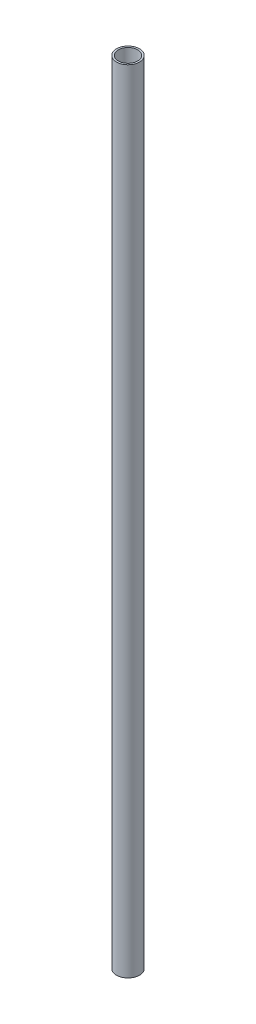
ISO-10303-21;
HEADER;
FILE_DESCRIPTION(('STEP AP214'),'2;1');
FILE_NAME('part.step','',(''),(''),'','','');
FILE_SCHEMA(('AUTOMOTIVE_DESIGN { 1 0 10303 214 1 1 1 1 }'));
ENDSEC;
DATA;
#1=APPLICATION_CONTEXT('core data for automotive mechanical design processes');
#2=APPLICATION_PROTOCOL_DEFINITION('international standard','automotive_design',2000,#1);
#3=PRODUCT_CONTEXT('',#1,'mechanical');
#4=PRODUCT('Part','Part','',(#3));
#5=PRODUCT_RELATED_PRODUCT_CATEGORY('part','',(#4));
#6=PRODUCT_DEFINITION_FORMATION('','',#4);
#7=PRODUCT_DEFINITION_CONTEXT('part definition',#1,'design');
#8=PRODUCT_DEFINITION('design','',#6,#7);
#9=PRODUCT_DEFINITION_SHAPE('','',#8);
#10=(LENGTH_UNIT() NAMED_UNIT(*) SI_UNIT(.MILLI.,.METRE.));
#11=(NAMED_UNIT(*) PLANE_ANGLE_UNIT() SI_UNIT($,.RADIAN.));
#12=(NAMED_UNIT(*) SI_UNIT($,.STERADIAN.) SOLID_ANGLE_UNIT());
#13=UNCERTAINTY_MEASURE_WITH_UNIT(LENGTH_MEASURE(1.E-05),#10,'distance_accuracy_value','');
#14=(GEOMETRIC_REPRESENTATION_CONTEXT(3) GLOBAL_UNCERTAINTY_ASSIGNED_CONTEXT((#13)) GLOBAL_UNIT_ASSIGNED_CONTEXT((#10,
#11,#12)) REPRESENTATION_CONTEXT('',''));
#15=CARTESIAN_POINT('',(0.,0.,0.));
#16=DIRECTION('',(0.,0.,1.));
#17=DIRECTION('',(1.,0.,0.));
#18=AXIS2_PLACEMENT_3D('',#15,#16,#17);
#19=CARTESIAN_POINT('',(0.,546.1,0.));
#20=DIRECTION('',(0.,1.,0.));
#21=DIRECTION('',(0.,0.,1.));
#22=AXIS2_PLACEMENT_3D('',#19,#20,#21);
#23=PLANE('',#22);
#24=CARTESIAN_POINT('',(0.,546.1,0.));
#25=DIRECTION('',(0.,1.,0.));
#26=DIRECTION('',(0.,0.,1.));
#27=AXIS2_PLACEMENT_3D('',#24,#25,#26);
#28=CIRCLE('',#27,7.9375);
#29=CARTESIAN_POINT('',(0.,546.1,7.9375));
#30=VERTEX_POINT('',#29);
#31=EDGE_CURVE('E10',#30,#30,#28,.T.);
#32=ORIENTED_EDGE('',*,*,#31,.T.);
#33=EDGE_LOOP('',(#32));
#34=FACE_BOUND('',#33,.T.);
#35=CARTESIAN_POINT('',(0.,546.1,0.));
#36=DIRECTION('',(0.,1.,0.));
#37=DIRECTION('',(0.,0.,1.));
#38=AXIS2_PLACEMENT_3D('',#35,#36,#37);
#39=CIRCLE('',#38,6.6929);
#40=CARTESIAN_POINT('',(0.,546.1,6.6929));
#41=VERTEX_POINT('',#40);
#42=EDGE_CURVE('E48',#41,#41,#39,.T.);
#43=ORIENTED_EDGE('',*,*,#42,.F.);
#44=EDGE_LOOP('',(#43));
#45=FACE_BOUND('',#44,.T.);
#46=ADVANCED_FACE('F37',(#34,#45),#23,.T.);
#47=CARTESIAN_POINT('',(0.,0.,0.));
#48=DIRECTION('',(0.,1.,0.));
#49=DIRECTION('',(0.,0.,1.));
#50=AXIS2_PLACEMENT_3D('',#47,#48,#49);
#51=PLANE('',#50);
#52=CARTESIAN_POINT('',(0.,0.,0.));
#53=DIRECTION('',(0.,1.,0.));
#54=DIRECTION('',(0.,0.,1.));
#55=AXIS2_PLACEMENT_3D('',#52,#53,#54);
#56=CIRCLE('',#55,7.9375);
#57=CARTESIAN_POINT('',(0.,0.,7.9375));
#58=VERTEX_POINT('',#57);
#59=EDGE_CURVE('E41',#58,#58,#56,.T.);
#60=ORIENTED_EDGE('',*,*,#59,.F.);
#61=EDGE_LOOP('',(#60));
#62=FACE_BOUND('',#61,.T.);
#63=CARTESIAN_POINT('',(0.,0.,0.));
#64=DIRECTION('',(0.,1.,0.));
#65=DIRECTION('',(0.,0.,1.));
#66=AXIS2_PLACEMENT_3D('',#63,#64,#65);
#67=CIRCLE('',#66,6.6929);
#68=CARTESIAN_POINT('',(0.,0.,6.6929));
#69=VERTEX_POINT('',#68);
#70=EDGE_CURVE('E50',#69,#69,#67,.T.);
#71=ORIENTED_EDGE('',*,*,#70,.T.);
#72=EDGE_LOOP('',(#71));
#73=FACE_BOUND('',#72,.T.);
#74=ADVANCED_FACE('F60',(#62,#73),#51,.F.);
#75=CARTESIAN_POINT('',(0.,546.1,0.));
#76=DIRECTION('',(0.,-1.,0.));
#77=DIRECTION('',(0.,0.,-1.));
#78=AXIS2_PLACEMENT_3D('',#75,#76,#77);
#79=CYLINDRICAL_SURFACE('',#78,7.9375);
#80=ORIENTED_EDGE('',*,*,#31,.F.);
#81=EDGE_LOOP('',(#80));
#82=FACE_BOUND('',#81,.T.);
#83=ORIENTED_EDGE('',*,*,#59,.T.);
#84=EDGE_LOOP('',(#83));
#85=FACE_BOUND('',#84,.T.);
#86=ADVANCED_FACE('F39',(#82,#85),#79,.T.);
#87=CARTESIAN_POINT('',(0.,546.1,0.));
#88=DIRECTION('',(0.,-1.,0.));
#89=DIRECTION('',(0.,0.,-1.));
#90=AXIS2_PLACEMENT_3D('',#87,#88,#89);
#91=CYLINDRICAL_SURFACE('',#90,6.6929);
#92=ORIENTED_EDGE('',*,*,#42,.T.);
#93=EDGE_LOOP('',(#92));
#94=FACE_BOUND('',#93,.T.);
#95=ORIENTED_EDGE('',*,*,#70,.F.);
#96=EDGE_LOOP('',(#95));
#97=FACE_BOUND('',#96,.T.);
#98=ADVANCED_FACE('F56',(#94,#97),#91,.F.);
#99=CLOSED_SHELL('',(#46,#74,#86,#98));
#100=MANIFOLD_SOLID_BREP('B2',#99);
#101=ADVANCED_BREP_SHAPE_REPRESENTATION('',(#18,#100),#14);
#102=SHAPE_DEFINITION_REPRESENTATION(#9,#101);
ENDSEC;
END-ISO-10303-21;
